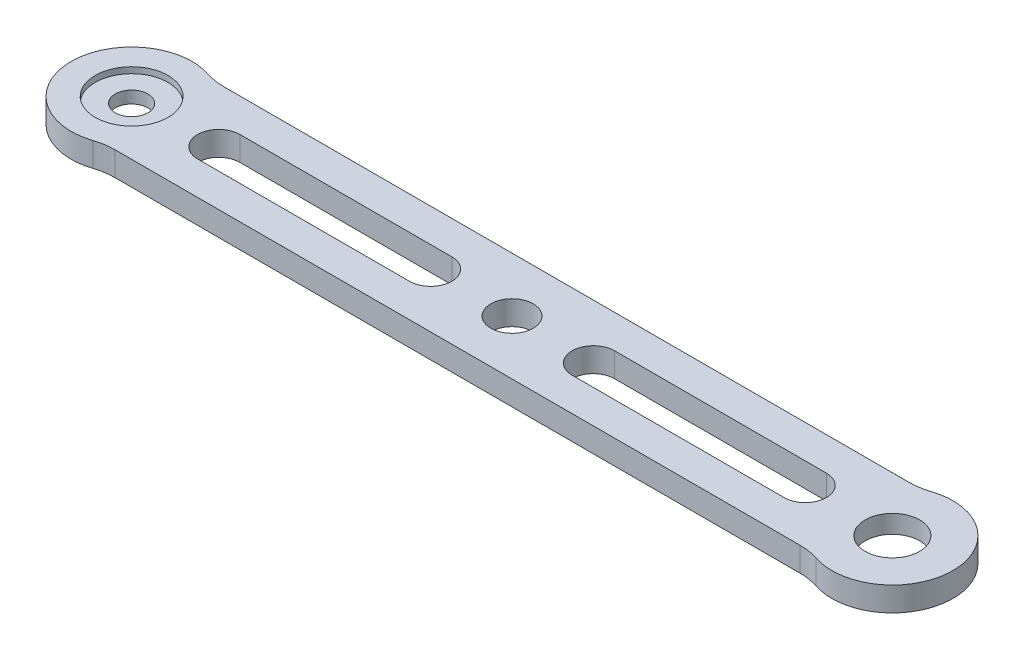
ISO-10303-21;
HEADER;
FILE_DESCRIPTION(('STEP AP214'),'2;1');
FILE_NAME('part.step','',(''),(''),'','','');
FILE_SCHEMA(('AUTOMOTIVE_DESIGN { 1 0 10303 214 1 1 1 1 }'));
ENDSEC;
DATA;
#1=APPLICATION_CONTEXT('core data for automotive mechanical design processes');
#2=APPLICATION_PROTOCOL_DEFINITION('international standard','automotive_design',2000,#1);
#3=PRODUCT_CONTEXT('',#1,'mechanical');
#4=PRODUCT('Part','Part','',(#3));
#5=PRODUCT_RELATED_PRODUCT_CATEGORY('part','',(#4));
#6=PRODUCT_DEFINITION_FORMATION('','',#4);
#7=PRODUCT_DEFINITION_CONTEXT('part definition',#1,'design');
#8=PRODUCT_DEFINITION('design','',#6,#7);
#9=PRODUCT_DEFINITION_SHAPE('','',#8);
#10=(LENGTH_UNIT() NAMED_UNIT(*) SI_UNIT(.MILLI.,.METRE.));
#11=(NAMED_UNIT(*) PLANE_ANGLE_UNIT() SI_UNIT($,.RADIAN.));
#12=(NAMED_UNIT(*) SI_UNIT($,.STERADIAN.) SOLID_ANGLE_UNIT());
#13=UNCERTAINTY_MEASURE_WITH_UNIT(LENGTH_MEASURE(1.E-05),#10,'distance_accuracy_value','');
#14=(GEOMETRIC_REPRESENTATION_CONTEXT(3) GLOBAL_UNCERTAINTY_ASSIGNED_CONTEXT((#13)) GLOBAL_UNIT_ASSIGNED_CONTEXT((#10,
#11,#12)) REPRESENTATION_CONTEXT('',''));
#15=CARTESIAN_POINT('',(0.,0.,0.));
#16=DIRECTION('',(0.,0.,1.));
#17=DIRECTION('',(1.,0.,0.));
#18=AXIS2_PLACEMENT_3D('',#15,#16,#17);
#19=CARTESIAN_POINT('',(0.,4.,0.));
#20=DIRECTION('',(0.,-1.,0.));
#21=DIRECTION('',(0.,0.,-1.));
#22=AXIS2_PLACEMENT_3D('',#19,#20,#21);
#23=CYLINDRICAL_SURFACE('',#22,2.7);
#24=CARTESIAN_POINT('',(0.,3.,0.));
#25=DIRECTION('',(0.,1.,0.));
#26=DIRECTION('',(0.,0.,1.));
#27=AXIS2_PLACEMENT_3D('',#24,#25,#26);
#28=CIRCLE('',#27,2.7);
#29=CARTESIAN_POINT('',(0.,3.,2.7));
#30=VERTEX_POINT('',#29);
#31=EDGE_CURVE('E248',#30,#30,#28,.T.);
#32=ORIENTED_EDGE('',*,*,#31,.T.);
#33=EDGE_LOOP('',(#32));
#34=FACE_BOUND('',#33,.T.);
#35=CARTESIAN_POINT('',(0.,1.,0.));
#36=DIRECTION('',(0.,-1.,0.));
#37=DIRECTION('',(0.,0.,-1.));
#38=AXIS2_PLACEMENT_3D('',#35,#36,#37);
#39=CIRCLE('',#38,2.7);
#40=CARTESIAN_POINT('',(0.,1.,-2.7));
#41=VERTEX_POINT('',#40);
#42=EDGE_CURVE('E253',#41,#41,#39,.T.);
#43=ORIENTED_EDGE('',*,*,#42,.T.);
#44=EDGE_LOOP('',(#43));
#45=FACE_BOUND('',#44,.T.);
#46=ADVANCED_FACE('F37',(#34,#45),#23,.F.);
#47=CARTESIAN_POINT('',(0.,4.,0.));
#48=DIRECTION('',(0.,1.,0.));
#49=DIRECTION('',(0.,0.,1.));
#50=AXIS2_PLACEMENT_3D('',#47,#48,#49);
#51=PLANE('',#50);
#52=CARTESIAN_POINT('',(125.6709,4.,0.));
#53=DIRECTION('',(0.,1.,0.));
#54=DIRECTION('',(0.,0.,1.));
#55=AXIS2_PLACEMENT_3D('',#52,#53,#54);
#56=CIRCLE('',#55,4.50500000000001);
#57=CARTESIAN_POINT('',(125.6709,4.,4.50500000000001));
#58=VERTEX_POINT('',#57);
#59=EDGE_CURVE('E262',#58,#58,#56,.T.);
#60=ORIENTED_EDGE('',*,*,#59,.F.);
#61=EDGE_LOOP('',(#60));
#62=FACE_BOUND('',#61,.T.);
#63=CARTESIAN_POINT('',(0.,4.,0.));
#64=DIRECTION('',(0.,1.,0.));
#65=DIRECTION('',(0.,0.,1.));
#66=AXIS2_PLACEMENT_3D('',#63,#64,#65);
#67=CIRCLE('',#66,6.01);
#68=CARTESIAN_POINT('',(0.,4.,6.01));
#69=VERTEX_POINT('',#68);
#70=EDGE_CURVE('E256',#69,#69,#67,.T.);
#71=ORIENTED_EDGE('',*,*,#70,.F.);
#72=EDGE_LOOP('',(#71));
#73=FACE_BOUND('',#72,.T.);
#74=DIRECTION('',(1.,0.,0.));
#75=VECTOR('',#74,1.);
#76=CARTESIAN_POINT('',(76.2753578739594,4.,3.5));
#77=LINE('',#76,#75);
#78=CARTESIAN_POINT('',(76.2753578739594,4.,3.5));
#79=VERTEX_POINT('',#78);
#80=CARTESIAN_POINT('',(111.275357873959,4.,3.5));
#81=VERTEX_POINT('',#80);
#82=EDGE_CURVE('E161',#79,#81,#77,.T.);
#83=ORIENTED_EDGE('',*,*,#82,.F.);
#84=CARTESIAN_POINT('',(76.2753578739594,4.,0.));
#85=DIRECTION('',(0.,1.,0.));
#86=DIRECTION('',(0.,0.,-1.));
#87=AXIS2_PLACEMENT_3D('',#84,#85,#86);
#88=CIRCLE('',#87,3.5);
#89=CARTESIAN_POINT('',(76.2753578739594,4.,-3.5));
#90=VERTEX_POINT('',#89);
#91=EDGE_CURVE('E151',#90,#79,#88,.T.);
#92=ORIENTED_EDGE('',*,*,#91,.F.);
#93=DIRECTION('',(-1.,0.,0.));
#94=VECTOR('',#93,1.);
#95=CARTESIAN_POINT('',(76.2753578739594,4.,-3.5));
#96=LINE('',#95,#94);
#97=CARTESIAN_POINT('',(111.275357873959,4.,-3.5));
#98=VERTEX_POINT('',#97);
#99=EDGE_CURVE('E178',#98,#90,#96,.T.);
#100=ORIENTED_EDGE('',*,*,#99,.F.);
#101=CARTESIAN_POINT('',(111.275357873959,4.,0.));
#102=DIRECTION('',(0.,1.,0.));
#103=DIRECTION('',(0.,0.,-1.));
#104=AXIS2_PLACEMENT_3D('',#101,#102,#103);
#105=CIRCLE('',#104,3.5);
#106=EDGE_CURVE('E176',#81,#98,#105,.T.);
#107=ORIENTED_EDGE('',*,*,#106,.F.);
#108=EDGE_LOOP('',(#83,#92,#100,#107));
#109=FACE_BOUND('',#108,.T.);
#110=DIRECTION('',(-1.,0.,0.));
#111=VECTOR('',#110,1.);
#112=CARTESIAN_POINT('',(49.3955421260406,4.,-3.5));
#113=LINE('',#112,#111);
#114=CARTESIAN_POINT('',(49.3955421260406,4.,-3.5));
#115=VERTEX_POINT('',#114);
#116=CARTESIAN_POINT('',(14.3955421260406,4.,-3.5));
#117=VERTEX_POINT('',#116);
#118=EDGE_CURVE('E198',#115,#117,#113,.T.);
#119=ORIENTED_EDGE('',*,*,#118,.F.);
#120=CARTESIAN_POINT('',(49.3955421260406,4.,0.));
#121=DIRECTION('',(0.,1.,0.));
#122=DIRECTION('',(0.,0.,1.));
#123=AXIS2_PLACEMENT_3D('',#120,#121,#122);
#124=CIRCLE('',#123,3.5);
#125=CARTESIAN_POINT('',(49.3955421260406,4.,3.5));
#126=VERTEX_POINT('',#125);
#127=EDGE_CURVE('E196',#126,#115,#124,.T.);
#128=ORIENTED_EDGE('',*,*,#127,.F.);
#129=DIRECTION('',(1.,0.,0.));
#130=VECTOR('',#129,1.);
#131=CARTESIAN_POINT('',(49.3955421260406,4.,3.5));
#132=LINE('',#131,#130);
#133=CARTESIAN_POINT('',(14.3955421260406,4.,3.5));
#134=VERTEX_POINT('',#133);
#135=EDGE_CURVE('E204',#134,#126,#132,.T.);
#136=ORIENTED_EDGE('',*,*,#135,.F.);
#137=CARTESIAN_POINT('',(14.3955421260406,4.,0.));
#138=DIRECTION('',(0.,1.,0.));
#139=DIRECTION('',(0.,0.,1.));
#140=AXIS2_PLACEMENT_3D('',#137,#138,#139);
#141=CIRCLE('',#140,3.5);
#142=EDGE_CURVE('E201',#117,#134,#141,.T.);
#143=ORIENTED_EDGE('',*,*,#142,.F.);
#144=EDGE_LOOP('',(#119,#128,#136,#143));
#145=FACE_BOUND('',#144,.T.);
#146=DIRECTION('',(-1.,0.,0.));
#147=VECTOR('',#146,1.);
#148=CARTESIAN_POINT('',(4.35889894354067,4.,-9.));
#149=LINE('',#148,#147);
#150=CARTESIAN_POINT('',(119.425902001602,4.,-9.));
#151=VERTEX_POINT('',#150);
#152=CARTESIAN_POINT('',(6.2449979983984,4.,-9.));
#153=VERTEX_POINT('',#152);
#154=EDGE_CURVE('E235',#151,#153,#149,.T.);
#155=ORIENTED_EDGE('',*,*,#154,.T.);
#156=CARTESIAN_POINT('',(6.2449979983984,4.,-19.));
#157=DIRECTION('',(0.,1.,0.));
#158=DIRECTION('',(0.,0.,1.));
#159=AXIS2_PLACEMENT_3D('',#156,#157,#158);
#160=CIRCLE('',#159,10.);
#161=CARTESIAN_POINT('',(3.1224989991992,4.,-9.5));
#162=VERTEX_POINT('',#161);
#163=EDGE_CURVE('E283',#153,#162,#160,.F.);
#164=ORIENTED_EDGE('',*,*,#163,.T.);
#165=CARTESIAN_POINT('',(0.,4.,0.));
#166=DIRECTION('',(0.,1.,0.));
#167=DIRECTION('',(0.,0.,1.));
#168=AXIS2_PLACEMENT_3D('',#165,#166,#167);
#169=CIRCLE('',#168,10.);
#170=CARTESIAN_POINT('',(3.1224989991992,4.,9.5));
#171=VERTEX_POINT('',#170);
#172=EDGE_CURVE('E227',#162,#171,#169,.T.);
#173=ORIENTED_EDGE('',*,*,#172,.T.);
#174=CARTESIAN_POINT('',(6.2449979983984,4.,19.));
#175=DIRECTION('',(0.,1.,0.));
#176=DIRECTION('',(0.,0.,1.));
#177=AXIS2_PLACEMENT_3D('',#174,#175,#176);
#178=CIRCLE('',#177,10.);
#179=CARTESIAN_POINT('',(6.2449979983984,4.,9.));
#180=VERTEX_POINT('',#179);
#181=EDGE_CURVE('E11',#171,#180,#178,.F.);
#182=ORIENTED_EDGE('',*,*,#181,.T.);
#183=DIRECTION('',(1.,0.,0.));
#184=VECTOR('',#183,1.);
#185=CARTESIAN_POINT('',(4.35889894354068,4.,9.));
#186=LINE('',#185,#184);
#187=CARTESIAN_POINT('',(119.425902001602,4.,9.));
#188=VERTEX_POINT('',#187);
#189=EDGE_CURVE('E229',#180,#188,#186,.T.);
#190=ORIENTED_EDGE('',*,*,#189,.T.);
#191=CARTESIAN_POINT('',(119.425902001602,4.,19.));
#192=DIRECTION('',(0.,1.,0.));
#193=DIRECTION('',(0.,0.,1.));
#194=AXIS2_PLACEMENT_3D('',#191,#192,#193);
#195=CIRCLE('',#194,10.);
#196=CARTESIAN_POINT('',(122.548401000801,4.,9.5));
#197=VERTEX_POINT('',#196);
#198=EDGE_CURVE('E291',#188,#197,#195,.F.);
#199=ORIENTED_EDGE('',*,*,#198,.T.);
#200=CARTESIAN_POINT('',(125.6709,4.,0.));
#201=DIRECTION('',(0.,1.,0.));
#202=DIRECTION('',(0.,0.,-1.));
#203=AXIS2_PLACEMENT_3D('',#200,#201,#202);
#204=CIRCLE('',#203,10.);
#205=CARTESIAN_POINT('',(122.548401000801,4.,-9.5));
#206=VERTEX_POINT('',#205);
#207=EDGE_CURVE('E232',#197,#206,#204,.T.);
#208=ORIENTED_EDGE('',*,*,#207,.T.);
#209=CARTESIAN_POINT('',(119.425902001602,4.,-19.));
#210=DIRECTION('',(0.,1.,0.));
#211=DIRECTION('',(0.,0.,1.));
#212=AXIS2_PLACEMENT_3D('',#209,#210,#211);
#213=CIRCLE('',#212,10.);
#214=EDGE_CURVE('E287',#206,#151,#213,.F.);
#215=ORIENTED_EDGE('',*,*,#214,.T.);
#216=EDGE_LOOP('',(#155,#164,#173,#182,#190,#199,#208,#215));
#217=FACE_BOUND('',#216,.T.);
#218=CARTESIAN_POINT('',(62.83545,4.,0.));
#219=DIRECTION('',(0.,1.,0.));
#220=DIRECTION('',(0.,0.,1.));
#221=AXIS2_PLACEMENT_3D('',#218,#219,#220);
#222=CIRCLE('',#221,3.50000000000001);
#223=CARTESIAN_POINT('',(62.83545,4.,3.50000000000001));
#224=VERTEX_POINT('',#223);
#225=EDGE_CURVE('E185',#224,#224,#222,.T.);
#226=ORIENTED_EDGE('',*,*,#225,.F.);
#227=EDGE_LOOP('',(#226));
#228=FACE_BOUND('',#227,.T.);
#229=ADVANCED_FACE('F173',(#62,#73,#109,#145,#217,#228),#51,.T.);
#230=CARTESIAN_POINT('',(0.,0.,0.));
#231=DIRECTION('',(0.,1.,0.));
#232=DIRECTION('',(0.,0.,1.));
#233=AXIS2_PLACEMENT_3D('',#230,#231,#232);
#234=PLANE('',#233);
#235=CARTESIAN_POINT('',(0.,0.,0.));
#236=DIRECTION('',(0.,-1.,0.));
#237=DIRECTION('',(0.,0.,-1.));
#238=AXIS2_PLACEMENT_3D('',#235,#236,#237);
#239=CIRCLE('',#238,6.01);
#240=CARTESIAN_POINT('',(0.,0.,-6.01));
#241=VERTEX_POINT('',#240);
#242=EDGE_CURVE('E261',#241,#241,#239,.T.);
#243=ORIENTED_EDGE('',*,*,#242,.F.);
#244=EDGE_LOOP('',(#243));
#245=FACE_BOUND('',#244,.T.);
#246=CARTESIAN_POINT('',(125.6709,0.,0.));
#247=DIRECTION('',(0.,-1.,0.));
#248=DIRECTION('',(0.,0.,-1.));
#249=AXIS2_PLACEMENT_3D('',#246,#247,#248);
#250=CIRCLE('',#249,6.01);
#251=CARTESIAN_POINT('',(125.6709,0.,-6.01));
#252=VERTEX_POINT('',#251);
#253=EDGE_CURVE('E251',#252,#252,#250,.T.);
#254=ORIENTED_EDGE('',*,*,#253,.F.);
#255=EDGE_LOOP('',(#254));
#256=FACE_BOUND('',#255,.T.);
#257=CARTESIAN_POINT('',(49.3955421260406,0.,0.));
#258=DIRECTION('',(0.,1.,0.));
#259=DIRECTION('',(0.,0.,1.));
#260=AXIS2_PLACEMENT_3D('',#257,#258,#259);
#261=CIRCLE('',#260,3.5);
#262=CARTESIAN_POINT('',(49.3955421260406,0.,3.5));
#263=VERTEX_POINT('',#262);
#264=CARTESIAN_POINT('',(49.3955421260406,0.,-3.5));
#265=VERTEX_POINT('',#264);
#266=EDGE_CURVE('E169',#263,#265,#261,.T.);
#267=ORIENTED_EDGE('',*,*,#266,.T.);
#268=DIRECTION('',(-1.,0.,0.));
#269=VECTOR('',#268,1.);
#270=CARTESIAN_POINT('',(49.3955421260406,0.,-3.5));
#271=LINE('',#270,#269);
#272=CARTESIAN_POINT('',(14.3955421260406,0.,-3.5));
#273=VERTEX_POINT('',#272);
#274=EDGE_CURVE('E209',#265,#273,#271,.T.);
#275=ORIENTED_EDGE('',*,*,#274,.T.);
#276=CARTESIAN_POINT('',(14.3955421260406,0.,0.));
#277=DIRECTION('',(0.,1.,0.));
#278=DIRECTION('',(0.,0.,1.));
#279=AXIS2_PLACEMENT_3D('',#276,#277,#278);
#280=CIRCLE('',#279,3.5);
#281=CARTESIAN_POINT('',(14.3955421260406,0.,3.5));
#282=VERTEX_POINT('',#281);
#283=EDGE_CURVE('E212',#273,#282,#280,.T.);
#284=ORIENTED_EDGE('',*,*,#283,.T.);
#285=DIRECTION('',(1.,0.,0.));
#286=VECTOR('',#285,1.);
#287=CARTESIAN_POINT('',(49.3955421260406,0.,3.5));
#288=LINE('',#287,#286);
#289=EDGE_CURVE('E199',#282,#263,#288,.T.);
#290=ORIENTED_EDGE('',*,*,#289,.T.);
#291=EDGE_LOOP('',(#267,#275,#284,#290));
#292=FACE_BOUND('',#291,.T.);
#293=CARTESIAN_POINT('',(0.,0.,0.));
#294=DIRECTION('',(0.,1.,0.));
#295=DIRECTION('',(0.,0.,1.));
#296=AXIS2_PLACEMENT_3D('',#293,#294,#295);
#297=CIRCLE('',#296,10.);
#298=CARTESIAN_POINT('',(3.1224989991992,0.,-9.5));
#299=VERTEX_POINT('',#298);
#300=CARTESIAN_POINT('',(3.1224989991992,0.,9.5));
#301=VERTEX_POINT('',#300);
#302=EDGE_CURVE('E226',#299,#301,#297,.T.);
#303=ORIENTED_EDGE('',*,*,#302,.F.);
#304=CARTESIAN_POINT('',(6.2449979983984,0.,-19.));
#305=DIRECTION('',(0.,1.,0.));
#306=DIRECTION('',(0.,0.,1.));
#307=AXIS2_PLACEMENT_3D('',#304,#305,#306);
#308=CIRCLE('',#307,10.);
#309=CARTESIAN_POINT('',(6.2449979983984,0.,-9.));
#310=VERTEX_POINT('',#309);
#311=EDGE_CURVE('E281',#299,#310,#308,.T.);
#312=ORIENTED_EDGE('',*,*,#311,.T.);
#313=DIRECTION('',(-1.,0.,0.));
#314=VECTOR('',#313,1.);
#315=CARTESIAN_POINT('',(4.35889894354067,0.,-9.));
#316=LINE('',#315,#314);
#317=CARTESIAN_POINT('',(119.425902001602,0.,-9.));
#318=VERTEX_POINT('',#317);
#319=EDGE_CURVE('E230',#318,#310,#316,.T.);
#320=ORIENTED_EDGE('',*,*,#319,.F.);
#321=CARTESIAN_POINT('',(119.425902001602,0.,-19.));
#322=DIRECTION('',(0.,1.,0.));
#323=DIRECTION('',(0.,0.,1.));
#324=AXIS2_PLACEMENT_3D('',#321,#322,#323);
#325=CIRCLE('',#324,10.);
#326=CARTESIAN_POINT('',(122.548401000801,0.,-9.5));
#327=VERTEX_POINT('',#326);
#328=EDGE_CURVE('E285',#318,#327,#325,.T.);
#329=ORIENTED_EDGE('',*,*,#328,.T.);
#330=CARTESIAN_POINT('',(125.6709,0.,0.));
#331=DIRECTION('',(0.,1.,0.));
#332=DIRECTION('',(0.,0.,-1.));
#333=AXIS2_PLACEMENT_3D('',#330,#331,#332);
#334=CIRCLE('',#333,10.);
#335=CARTESIAN_POINT('',(122.548401000801,0.,9.5));
#336=VERTEX_POINT('',#335);
#337=EDGE_CURVE('E243',#336,#327,#334,.T.);
#338=ORIENTED_EDGE('',*,*,#337,.F.);
#339=CARTESIAN_POINT('',(119.425902001602,0.,19.));
#340=DIRECTION('',(0.,1.,0.));
#341=DIRECTION('',(0.,0.,1.));
#342=AXIS2_PLACEMENT_3D('',#339,#340,#341);
#343=CIRCLE('',#342,10.);
#344=CARTESIAN_POINT('',(119.425902001602,0.,9.));
#345=VERTEX_POINT('',#344);
#346=EDGE_CURVE('E289',#336,#345,#343,.T.);
#347=ORIENTED_EDGE('',*,*,#346,.T.);
#348=DIRECTION('',(1.,0.,0.));
#349=VECTOR('',#348,1.);
#350=CARTESIAN_POINT('',(4.35889894354068,0.,9.));
#351=LINE('',#350,#349);
#352=CARTESIAN_POINT('',(6.2449979983984,0.,9.));
#353=VERTEX_POINT('',#352);
#354=EDGE_CURVE('E241',#353,#345,#351,.T.);
#355=ORIENTED_EDGE('',*,*,#354,.F.);
#356=CARTESIAN_POINT('',(6.2449979983984,0.,19.));
#357=DIRECTION('',(0.,1.,0.));
#358=DIRECTION('',(0.,0.,1.));
#359=AXIS2_PLACEMENT_3D('',#356,#357,#358);
#360=CIRCLE('',#359,10.);
#361=EDGE_CURVE('E45',#353,#301,#360,.T.);
#362=ORIENTED_EDGE('',*,*,#361,.T.);
#363=EDGE_LOOP('',(#303,#312,#320,#329,#338,#347,#355,#362));
#364=FACE_BOUND('',#363,.T.);
#365=CARTESIAN_POINT('',(76.2753578739594,0.,0.));
#366=DIRECTION('',(0.,1.,0.));
#367=DIRECTION('',(0.,0.,-1.));
#368=AXIS2_PLACEMENT_3D('',#365,#366,#367);
#369=CIRCLE('',#368,3.5);
#370=CARTESIAN_POINT('',(76.2753578739594,0.,-3.5));
#371=VERTEX_POINT('',#370);
#372=CARTESIAN_POINT('',(76.2753578739594,0.,3.5));
#373=VERTEX_POINT('',#372);
#374=EDGE_CURVE('E183',#371,#373,#369,.T.);
#375=ORIENTED_EDGE('',*,*,#374,.T.);
#376=DIRECTION('',(1.,0.,0.));
#377=VECTOR('',#376,1.);
#378=CARTESIAN_POINT('',(76.2753578739594,0.,3.5));
#379=LINE('',#378,#377);
#380=CARTESIAN_POINT('',(111.275357873959,0.,3.5));
#381=VERTEX_POINT('',#380);
#382=EDGE_CURVE('E168',#373,#381,#379,.T.);
#383=ORIENTED_EDGE('',*,*,#382,.T.);
#384=CARTESIAN_POINT('',(111.275357873959,0.,0.));
#385=DIRECTION('',(0.,1.,0.));
#386=DIRECTION('',(0.,0.,-1.));
#387=AXIS2_PLACEMENT_3D('',#384,#385,#386);
#388=CIRCLE('',#387,3.5);
#389=CARTESIAN_POINT('',(111.275357873959,0.,-3.5));
#390=VERTEX_POINT('',#389);
#391=EDGE_CURVE('E187',#381,#390,#388,.T.);
#392=ORIENTED_EDGE('',*,*,#391,.T.);
#393=DIRECTION('',(-1.,0.,0.));
#394=VECTOR('',#393,1.);
#395=CARTESIAN_POINT('',(76.2753578739594,0.,-3.5));
#396=LINE('',#395,#394);
#397=EDGE_CURVE('E162',#390,#371,#396,.T.);
#398=ORIENTED_EDGE('',*,*,#397,.T.);
#399=EDGE_LOOP('',(#375,#383,#392,#398));
#400=FACE_BOUND('',#399,.T.);
#401=CARTESIAN_POINT('',(62.83545,0.,0.));
#402=DIRECTION('',(0.,1.,0.));
#403=DIRECTION('',(0.,0.,1.));
#404=AXIS2_PLACEMENT_3D('',#401,#402,#403);
#405=CIRCLE('',#404,3.50000000000001);
#406=CARTESIAN_POINT('',(62.83545,0.,3.50000000000001));
#407=VERTEX_POINT('',#406);
#408=EDGE_CURVE('E589',#407,#407,#405,.T.);
#409=ORIENTED_EDGE('',*,*,#408,.T.);
#410=EDGE_LOOP('',(#409));
#411=FACE_BOUND('',#410,.T.);
#412=ADVANCED_FACE('F295',(#245,#256,#292,#364,#400,#411),#234,.F.);
#413=CARTESIAN_POINT('',(0.,4.,0.));
#414=DIRECTION('',(0.,-1.,0.));
#415=DIRECTION('',(0.,0.,-1.));
#416=AXIS2_PLACEMENT_3D('',#413,#414,#415);
#417=CYLINDRICAL_SURFACE('',#416,10.);
#418=ORIENTED_EDGE('',*,*,#172,.F.);
#419=DIRECTION('',(0.,-1.,0.));
#420=VECTOR('',#419,1.);
#421=CARTESIAN_POINT('',(3.1224989991992,4.,-9.5));
#422=LINE('',#421,#420);
#423=EDGE_CURVE('E264',#162,#299,#422,.T.);
#424=ORIENTED_EDGE('',*,*,#423,.T.);
#425=ORIENTED_EDGE('',*,*,#302,.T.);
#426=DIRECTION('',(0.,-1.,0.));
#427=VECTOR('',#426,1.);
#428=CARTESIAN_POINT('',(3.1224989991992,4.,9.5));
#429=LINE('',#428,#427);
#430=EDGE_CURVE('E238',#301,#171,#429,.F.);
#431=ORIENTED_EDGE('',*,*,#430,.T.);
#432=EDGE_LOOP('',(#418,#424,#425,#431));
#433=FACE_BOUND('',#432,.T.);
#434=ADVANCED_FACE('F302',(#433),#417,.T.);
#435=CARTESIAN_POINT('',(4.35889894354068,4.,9.));
#436=DIRECTION('',(0.,0.,-1.));
#437=DIRECTION('',(-1.,0.,0.));
#438=AXIS2_PLACEMENT_3D('',#435,#436,#437);
#439=PLANE('',#438);
#440=ORIENTED_EDGE('',*,*,#354,.T.);
#441=DIRECTION('',(0.,1.,0.));
#442=VECTOR('',#441,1.);
#443=CARTESIAN_POINT('',(119.425902001602,4.,9.));
#444=LINE('',#443,#442);
#445=EDGE_CURVE('E52',#345,#188,#444,.T.);
#446=ORIENTED_EDGE('',*,*,#445,.T.);
#447=ORIENTED_EDGE('',*,*,#189,.F.);
#448=DIRECTION('',(0.,1.,0.));
#449=VECTOR('',#448,1.);
#450=CARTESIAN_POINT('',(6.2449979983984,0.,9.));
#451=LINE('',#450,#449);
#452=EDGE_CURVE('E277',#180,#353,#451,.F.);
#453=ORIENTED_EDGE('',*,*,#452,.T.);
#454=EDGE_LOOP('',(#440,#446,#447,#453));
#455=FACE_BOUND('',#454,.T.);
#456=ADVANCED_FACE('F304',(#455),#439,.F.);
#457=CARTESIAN_POINT('',(125.6709,4.,0.));
#458=DIRECTION('',(0.,-1.,0.));
#459=DIRECTION('',(0.,0.,-1.));
#460=AXIS2_PLACEMENT_3D('',#457,#458,#459);
#461=CYLINDRICAL_SURFACE('',#460,10.);
#462=ORIENTED_EDGE('',*,*,#337,.T.);
#463=DIRECTION('',(0.,-1.,0.));
#464=VECTOR('',#463,1.);
#465=CARTESIAN_POINT('',(122.548401000801,4.,-9.5));
#466=LINE('',#465,#464);
#467=EDGE_CURVE('E275',#327,#206,#466,.F.);
#468=ORIENTED_EDGE('',*,*,#467,.T.);
#469=ORIENTED_EDGE('',*,*,#207,.F.);
#470=DIRECTION('',(0.,-1.,0.));
#471=VECTOR('',#470,1.);
#472=CARTESIAN_POINT('',(122.548401000801,4.,9.5));
#473=LINE('',#472,#471);
#474=EDGE_CURVE('E272',#197,#336,#473,.T.);
#475=ORIENTED_EDGE('',*,*,#474,.T.);
#476=EDGE_LOOP('',(#462,#468,#469,#475));
#477=FACE_BOUND('',#476,.T.);
#478=ADVANCED_FACE('F313',(#477),#461,.T.);
#479=CARTESIAN_POINT('',(4.35889894354067,4.,-9.));
#480=DIRECTION('',(0.,0.,1.));
#481=DIRECTION('',(1.,0.,0.));
#482=AXIS2_PLACEMENT_3D('',#479,#480,#481);
#483=PLANE('',#482);
#484=ORIENTED_EDGE('',*,*,#319,.T.);
#485=DIRECTION('',(0.,1.,0.));
#486=VECTOR('',#485,1.);
#487=CARTESIAN_POINT('',(6.2449979983984,4.,-9.));
#488=LINE('',#487,#486);
#489=EDGE_CURVE('E270',#310,#153,#488,.T.);
#490=ORIENTED_EDGE('',*,*,#489,.T.);
#491=ORIENTED_EDGE('',*,*,#154,.F.);
#492=DIRECTION('',(0.,1.,0.));
#493=VECTOR('',#492,1.);
#494=CARTESIAN_POINT('',(119.425902001602,0.,-9.));
#495=LINE('',#494,#493);
#496=EDGE_CURVE('E267',#151,#318,#495,.F.);
#497=ORIENTED_EDGE('',*,*,#496,.T.);
#498=EDGE_LOOP('',(#484,#490,#491,#497));
#499=FACE_BOUND('',#498,.T.);
#500=ADVANCED_FACE('F322',(#499),#483,.F.);
#501=CARTESIAN_POINT('',(49.3955421260406,4.,0.));
#502=DIRECTION('',(0.,-1.,0.));
#503=DIRECTION('',(0.,0.,-1.));
#504=AXIS2_PLACEMENT_3D('',#501,#502,#503);
#505=CYLINDRICAL_SURFACE('',#504,3.5);
#506=ORIENTED_EDGE('',*,*,#266,.F.);
#507=DIRECTION('',(0.,-1.,0.));
#508=VECTOR('',#507,1.);
#509=CARTESIAN_POINT('',(49.3955421260406,4.,3.5));
#510=LINE('',#509,#508);
#511=EDGE_CURVE('E206',#126,#263,#510,.T.);
#512=ORIENTED_EDGE('',*,*,#511,.F.);
#513=ORIENTED_EDGE('',*,*,#127,.T.);
#514=DIRECTION('',(0.,-1.,0.));
#515=VECTOR('',#514,1.);
#516=CARTESIAN_POINT('',(49.3955421260406,4.,-3.5));
#517=LINE('',#516,#515);
#518=EDGE_CURVE('E223',#115,#265,#517,.T.);
#519=ORIENTED_EDGE('',*,*,#518,.T.);
#520=EDGE_LOOP('',(#506,#512,#513,#519));
#521=FACE_BOUND('',#520,.T.);
#522=ADVANCED_FACE('F349',(#521),#505,.F.);
#523=CARTESIAN_POINT('',(49.3955421260406,4.,-3.5));
#524=DIRECTION('',(0.,0.,1.));
#525=DIRECTION('',(1.,0.,0.));
#526=AXIS2_PLACEMENT_3D('',#523,#524,#525);
#527=PLANE('',#526);
#528=ORIENTED_EDGE('',*,*,#274,.F.);
#529=ORIENTED_EDGE('',*,*,#518,.F.);
#530=ORIENTED_EDGE('',*,*,#118,.T.);
#531=DIRECTION('',(0.,-1.,0.));
#532=VECTOR('',#531,1.);
#533=CARTESIAN_POINT('',(14.3955421260406,4.,-3.5));
#534=LINE('',#533,#532);
#535=EDGE_CURVE('E221',#117,#273,#534,.T.);
#536=ORIENTED_EDGE('',*,*,#535,.T.);
#537=EDGE_LOOP('',(#528,#529,#530,#536));
#538=FACE_BOUND('',#537,.T.);
#539=ADVANCED_FACE('F383',(#538),#527,.T.);
#540=CARTESIAN_POINT('',(14.3955421260406,4.,0.));
#541=DIRECTION('',(0.,-1.,0.));
#542=DIRECTION('',(0.,0.,-1.));
#543=AXIS2_PLACEMENT_3D('',#540,#541,#542);
#544=CYLINDRICAL_SURFACE('',#543,3.5);
#545=ORIENTED_EDGE('',*,*,#283,.F.);
#546=ORIENTED_EDGE('',*,*,#535,.F.);
#547=ORIENTED_EDGE('',*,*,#142,.T.);
#548=DIRECTION('',(0.,-1.,0.));
#549=VECTOR('',#548,1.);
#550=CARTESIAN_POINT('',(14.3955421260406,4.,3.5));
#551=LINE('',#550,#549);
#552=EDGE_CURVE('E219',#134,#282,#551,.T.);
#553=ORIENTED_EDGE('',*,*,#552,.T.);
#554=EDGE_LOOP('',(#545,#546,#547,#553));
#555=FACE_BOUND('',#554,.T.);
#556=ADVANCED_FACE('F390',(#555),#544,.F.);
#557=CARTESIAN_POINT('',(49.3955421260406,4.,3.5));
#558=DIRECTION('',(0.,0.,-1.));
#559=DIRECTION('',(-1.,0.,0.));
#560=AXIS2_PLACEMENT_3D('',#557,#558,#559);
#561=PLANE('',#560);
#562=ORIENTED_EDGE('',*,*,#289,.F.);
#563=ORIENTED_EDGE('',*,*,#552,.F.);
#564=ORIENTED_EDGE('',*,*,#135,.T.);
#565=ORIENTED_EDGE('',*,*,#511,.T.);
#566=EDGE_LOOP('',(#562,#563,#564,#565));
#567=FACE_BOUND('',#566,.T.);
#568=ADVANCED_FACE('F397',(#567),#561,.T.);
#569=CARTESIAN_POINT('',(76.2753578739594,4.,0.));
#570=DIRECTION('',(0.,-1.,0.));
#571=DIRECTION('',(0.,0.,-1.));
#572=AXIS2_PLACEMENT_3D('',#569,#570,#571);
#573=CYLINDRICAL_SURFACE('',#572,3.5);
#574=ORIENTED_EDGE('',*,*,#374,.F.);
#575=DIRECTION('',(0.,-1.,0.));
#576=VECTOR('',#575,1.);
#577=CARTESIAN_POINT('',(76.2753578739594,4.,-3.5));
#578=LINE('',#577,#576);
#579=EDGE_CURVE('E157',#90,#371,#578,.T.);
#580=ORIENTED_EDGE('',*,*,#579,.F.);
#581=ORIENTED_EDGE('',*,*,#91,.T.);
#582=DIRECTION('',(0.,-1.,0.));
#583=VECTOR('',#582,1.);
#584=CARTESIAN_POINT('',(76.2753578739594,4.,3.5));
#585=LINE('',#584,#583);
#586=EDGE_CURVE('E154',#79,#373,#585,.T.);
#587=ORIENTED_EDGE('',*,*,#586,.T.);
#588=EDGE_LOOP('',(#574,#580,#581,#587));
#589=FACE_BOUND('',#588,.T.);
#590=ADVANCED_FACE('F153',(#589),#573,.F.);
#591=CARTESIAN_POINT('',(76.2753578739594,4.,3.5));
#592=DIRECTION('',(0.,0.,-1.));
#593=DIRECTION('',(-1.,0.,0.));
#594=AXIS2_PLACEMENT_3D('',#591,#592,#593);
#595=PLANE('',#594);
#596=ORIENTED_EDGE('',*,*,#382,.F.);
#597=ORIENTED_EDGE('',*,*,#586,.F.);
#598=ORIENTED_EDGE('',*,*,#82,.T.);
#599=DIRECTION('',(0.,-1.,0.));
#600=VECTOR('',#599,1.);
#601=CARTESIAN_POINT('',(111.275357873959,4.,3.5));
#602=LINE('',#601,#600);
#603=EDGE_CURVE('E170',#81,#381,#602,.T.);
#604=ORIENTED_EDGE('',*,*,#603,.T.);
#605=EDGE_LOOP('',(#596,#597,#598,#604));
#606=FACE_BOUND('',#605,.T.);
#607=ADVANCED_FACE('F165',(#606),#595,.T.);
#608=CARTESIAN_POINT('',(111.275357873959,4.,0.));
#609=DIRECTION('',(0.,-1.,0.));
#610=DIRECTION('',(0.,0.,-1.));
#611=AXIS2_PLACEMENT_3D('',#608,#609,#610);
#612=CYLINDRICAL_SURFACE('',#611,3.5);
#613=ORIENTED_EDGE('',*,*,#391,.F.);
#614=ORIENTED_EDGE('',*,*,#603,.F.);
#615=ORIENTED_EDGE('',*,*,#106,.T.);
#616=DIRECTION('',(0.,-1.,0.));
#617=VECTOR('',#616,1.);
#618=CARTESIAN_POINT('',(111.275357873959,4.,-3.5));
#619=LINE('',#618,#617);
#620=EDGE_CURVE('E193',#98,#390,#619,.T.);
#621=ORIENTED_EDGE('',*,*,#620,.T.);
#622=EDGE_LOOP('',(#613,#614,#615,#621));
#623=FACE_BOUND('',#622,.T.);
#624=ADVANCED_FACE('F418',(#623),#612,.F.);
#625=CARTESIAN_POINT('',(76.2753578739594,4.,-3.5));
#626=DIRECTION('',(0.,0.,1.));
#627=DIRECTION('',(1.,0.,0.));
#628=AXIS2_PLACEMENT_3D('',#625,#626,#627);
#629=PLANE('',#628);
#630=ORIENTED_EDGE('',*,*,#397,.F.);
#631=ORIENTED_EDGE('',*,*,#620,.F.);
#632=ORIENTED_EDGE('',*,*,#99,.T.);
#633=ORIENTED_EDGE('',*,*,#579,.T.);
#634=EDGE_LOOP('',(#630,#631,#632,#633));
#635=FACE_BOUND('',#634,.T.);
#636=ADVANCED_FACE('F425',(#635),#629,.T.);
#637=CARTESIAN_POINT('',(62.83545,4.,0.));
#638=DIRECTION('',(0.,-1.,0.));
#639=DIRECTION('',(0.,0.,-1.));
#640=AXIS2_PLACEMENT_3D('',#637,#638,#639);
#641=CYLINDRICAL_SURFACE('',#640,3.50000000000001);
#642=ORIENTED_EDGE('',*,*,#225,.T.);
#643=EDGE_LOOP('',(#642));
#644=FACE_BOUND('',#643,.T.);
#645=ORIENTED_EDGE('',*,*,#408,.F.);
#646=EDGE_LOOP('',(#645));
#647=FACE_BOUND('',#646,.T.);
#648=ADVANCED_FACE('F433',(#644,#647),#641,.F.);
#649=CARTESIAN_POINT('',(125.6709,1.,0.));
#650=DIRECTION('',(0.,-1.,0.));
#651=DIRECTION('',(0.,0.,-1.));
#652=AXIS2_PLACEMENT_3D('',#649,#650,#651);
#653=CYLINDRICAL_SURFACE('',#652,6.01);
#654=CARTESIAN_POINT('',(125.6709,1.,0.));
#655=DIRECTION('',(0.,-1.,0.));
#656=DIRECTION('',(0.,0.,-1.));
#657=AXIS2_PLACEMENT_3D('',#654,#655,#656);
#658=CIRCLE('',#657,6.01);
#659=CARTESIAN_POINT('',(125.6709,1.,-6.01));
#660=VERTEX_POINT('',#659);
#661=EDGE_CURVE('E586',#660,#660,#658,.T.);
#662=ORIENTED_EDGE('',*,*,#661,.F.);
#663=EDGE_LOOP('',(#662));
#664=FACE_BOUND('',#663,.T.);
#665=ORIENTED_EDGE('',*,*,#253,.T.);
#666=EDGE_LOOP('',(#665));
#667=FACE_BOUND('',#666,.T.);
#668=ADVANCED_FACE('F441',(#664,#667),#653,.F.);
#669=CARTESIAN_POINT('',(125.6709,1.,0.));
#670=DIRECTION('',(0.,-1.,0.));
#671=DIRECTION('',(0.,0.,-1.));
#672=AXIS2_PLACEMENT_3D('',#669,#670,#671);
#673=PLANE('',#672);
#674=CARTESIAN_POINT('',(125.6709,1.,0.));
#675=DIRECTION('',(0.,-1.,0.));
#676=DIRECTION('',(0.,0.,-1.));
#677=AXIS2_PLACEMENT_3D('',#674,#675,#676);
#678=CIRCLE('',#677,4.50500000000001);
#679=CARTESIAN_POINT('',(125.6709,1.,-4.50500000000001));
#680=VERTEX_POINT('',#679);
#681=EDGE_CURVE('E258',#680,#680,#678,.T.);
#682=ORIENTED_EDGE('',*,*,#681,.F.);
#683=EDGE_LOOP('',(#682));
#684=FACE_BOUND('',#683,.T.);
#685=ORIENTED_EDGE('',*,*,#661,.T.);
#686=EDGE_LOOP('',(#685));
#687=FACE_BOUND('',#686,.T.);
#688=ADVANCED_FACE('F449',(#684,#687),#673,.T.);
#689=CARTESIAN_POINT('',(0.,3.,0.));
#690=DIRECTION('',(0.,1.,0.));
#691=DIRECTION('',(0.,0.,1.));
#692=AXIS2_PLACEMENT_3D('',#689,#690,#691);
#693=CYLINDRICAL_SURFACE('',#692,6.01);
#694=CARTESIAN_POINT('',(0.,3.,0.));
#695=DIRECTION('',(0.,1.,0.));
#696=DIRECTION('',(0.,0.,1.));
#697=AXIS2_PLACEMENT_3D('',#694,#695,#696);
#698=CIRCLE('',#697,6.01);
#699=CARTESIAN_POINT('',(0.,3.,6.01));
#700=VERTEX_POINT('',#699);
#701=EDGE_CURVE('E252',#700,#700,#698,.T.);
#702=ORIENTED_EDGE('',*,*,#701,.F.);
#703=EDGE_LOOP('',(#702));
#704=FACE_BOUND('',#703,.T.);
#705=ORIENTED_EDGE('',*,*,#70,.T.);
#706=EDGE_LOOP('',(#705));
#707=FACE_BOUND('',#706,.T.);
#708=ADVANCED_FACE('F458',(#704,#707),#693,.F.);
#709=CARTESIAN_POINT('',(0.,3.,0.));
#710=DIRECTION('',(0.,1.,0.));
#711=DIRECTION('',(0.,0.,1.));
#712=AXIS2_PLACEMENT_3D('',#709,#710,#711);
#713=PLANE('',#712);
#714=ORIENTED_EDGE('',*,*,#31,.F.);
#715=EDGE_LOOP('',(#714));
#716=FACE_BOUND('',#715,.T.);
#717=ORIENTED_EDGE('',*,*,#701,.T.);
#718=EDGE_LOOP('',(#717));
#719=FACE_BOUND('',#718,.T.);
#720=ADVANCED_FACE('F467',(#716,#719),#713,.T.);
#721=CARTESIAN_POINT('',(0.,1.,0.));
#722=DIRECTION('',(0.,-1.,0.));
#723=DIRECTION('',(0.,0.,-1.));
#724=AXIS2_PLACEMENT_3D('',#721,#722,#723);
#725=CYLINDRICAL_SURFACE('',#724,6.01);
#726=CARTESIAN_POINT('',(0.,1.,0.));
#727=DIRECTION('',(0.,-1.,0.));
#728=DIRECTION('',(0.,0.,-1.));
#729=AXIS2_PLACEMENT_3D('',#726,#727,#728);
#730=CIRCLE('',#729,6.01);
#731=CARTESIAN_POINT('',(0.,1.,-6.01));
#732=VERTEX_POINT('',#731);
#733=EDGE_CURVE('E257',#732,#732,#730,.T.);
#734=ORIENTED_EDGE('',*,*,#733,.F.);
#735=EDGE_LOOP('',(#734));
#736=FACE_BOUND('',#735,.T.);
#737=ORIENTED_EDGE('',*,*,#242,.T.);
#738=EDGE_LOOP('',(#737));
#739=FACE_BOUND('',#738,.T.);
#740=ADVANCED_FACE('F475',(#736,#739),#725,.F.);
#741=CARTESIAN_POINT('',(0.,1.,0.));
#742=DIRECTION('',(0.,-1.,0.));
#743=DIRECTION('',(0.,0.,-1.));
#744=AXIS2_PLACEMENT_3D('',#741,#742,#743);
#745=PLANE('',#744);
#746=ORIENTED_EDGE('',*,*,#42,.F.);
#747=EDGE_LOOP('',(#746));
#748=FACE_BOUND('',#747,.T.);
#749=ORIENTED_EDGE('',*,*,#733,.T.);
#750=EDGE_LOOP('',(#749));
#751=FACE_BOUND('',#750,.T.);
#752=ADVANCED_FACE('F335',(#748,#751),#745,.T.);
#753=CARTESIAN_POINT('',(125.6709,0.,0.));
#754=DIRECTION('',(0.,1.,0.));
#755=DIRECTION('',(0.,0.,1.));
#756=AXIS2_PLACEMENT_3D('',#753,#754,#755);
#757=CYLINDRICAL_SURFACE('',#756,4.50500000000001);
#758=ORIENTED_EDGE('',*,*,#681,.T.);
#759=EDGE_LOOP('',(#758));
#760=FACE_BOUND('',#759,.T.);
#761=ORIENTED_EDGE('',*,*,#59,.T.);
#762=EDGE_LOOP('',(#761));
#763=FACE_BOUND('',#762,.T.);
#764=ADVANCED_FACE('F328',(#760,#763),#757,.F.);
#765=CARTESIAN_POINT('',(6.2449979983984,4.,-19.));
#766=DIRECTION('',(0.,-1.,0.));
#767=DIRECTION('',(0.,0.,-1.));
#768=AXIS2_PLACEMENT_3D('',#765,#766,#767);
#769=CYLINDRICAL_SURFACE('',#768,10.);
#770=ORIENTED_EDGE('',*,*,#163,.F.);
#771=ORIENTED_EDGE('',*,*,#489,.F.);
#772=ORIENTED_EDGE('',*,*,#311,.F.);
#773=ORIENTED_EDGE('',*,*,#423,.F.);
#774=EDGE_LOOP('',(#770,#771,#772,#773));
#775=FACE_BOUND('',#774,.T.);
#776=ADVANCED_FACE('F326',(#775),#769,.F.);
#777=CARTESIAN_POINT('',(119.425902001602,4.,-19.));
#778=DIRECTION('',(0.,-1.,0.));
#779=DIRECTION('',(0.,0.,-1.));
#780=AXIS2_PLACEMENT_3D('',#777,#778,#779);
#781=CYLINDRICAL_SURFACE('',#780,10.);
#782=ORIENTED_EDGE('',*,*,#214,.F.);
#783=ORIENTED_EDGE('',*,*,#467,.F.);
#784=ORIENTED_EDGE('',*,*,#328,.F.);
#785=ORIENTED_EDGE('',*,*,#496,.F.);
#786=EDGE_LOOP('',(#782,#783,#784,#785));
#787=FACE_BOUND('',#786,.T.);
#788=ADVANCED_FACE('F319',(#787),#781,.F.);
#789=CARTESIAN_POINT('',(119.425902001602,4.,19.));
#790=DIRECTION('',(0.,-1.,0.));
#791=DIRECTION('',(0.,0.,-1.));
#792=AXIS2_PLACEMENT_3D('',#789,#790,#791);
#793=CYLINDRICAL_SURFACE('',#792,10.);
#794=ORIENTED_EDGE('',*,*,#198,.F.);
#795=ORIENTED_EDGE('',*,*,#445,.F.);
#796=ORIENTED_EDGE('',*,*,#346,.F.);
#797=ORIENTED_EDGE('',*,*,#474,.F.);
#798=EDGE_LOOP('',(#794,#795,#796,#797));
#799=FACE_BOUND('',#798,.T.);
#800=ADVANCED_FACE('F310',(#799),#793,.F.);
#801=CARTESIAN_POINT('',(6.2449979983984,4.,19.));
#802=DIRECTION('',(0.,-1.,0.));
#803=DIRECTION('',(0.,0.,-1.));
#804=AXIS2_PLACEMENT_3D('',#801,#802,#803);
#805=CYLINDRICAL_SURFACE('',#804,10.);
#806=ORIENTED_EDGE('',*,*,#181,.F.);
#807=ORIENTED_EDGE('',*,*,#430,.F.);
#808=ORIENTED_EDGE('',*,*,#361,.F.);
#809=ORIENTED_EDGE('',*,*,#452,.F.);
#810=EDGE_LOOP('',(#806,#807,#808,#809));
#811=FACE_BOUND('',#810,.T.);
#812=ADVANCED_FACE('F39',(#811),#805,.F.);
#813=CLOSED_SHELL('',(#46,#229,#412,#434,#456,#478,#500,#522,#539,#556,#568,#590,#607,#624,#636,
#648,#668,#688,#708,#720,#740,#752,#764,#776,#788,#800,#812));
#814=MANIFOLD_SOLID_BREP('B2',#813);
#815=ADVANCED_BREP_SHAPE_REPRESENTATION('',(#18,#814),#14);
#816=SHAPE_DEFINITION_REPRESENTATION(#9,#815);
ENDSEC;
END-ISO-10303-21;
